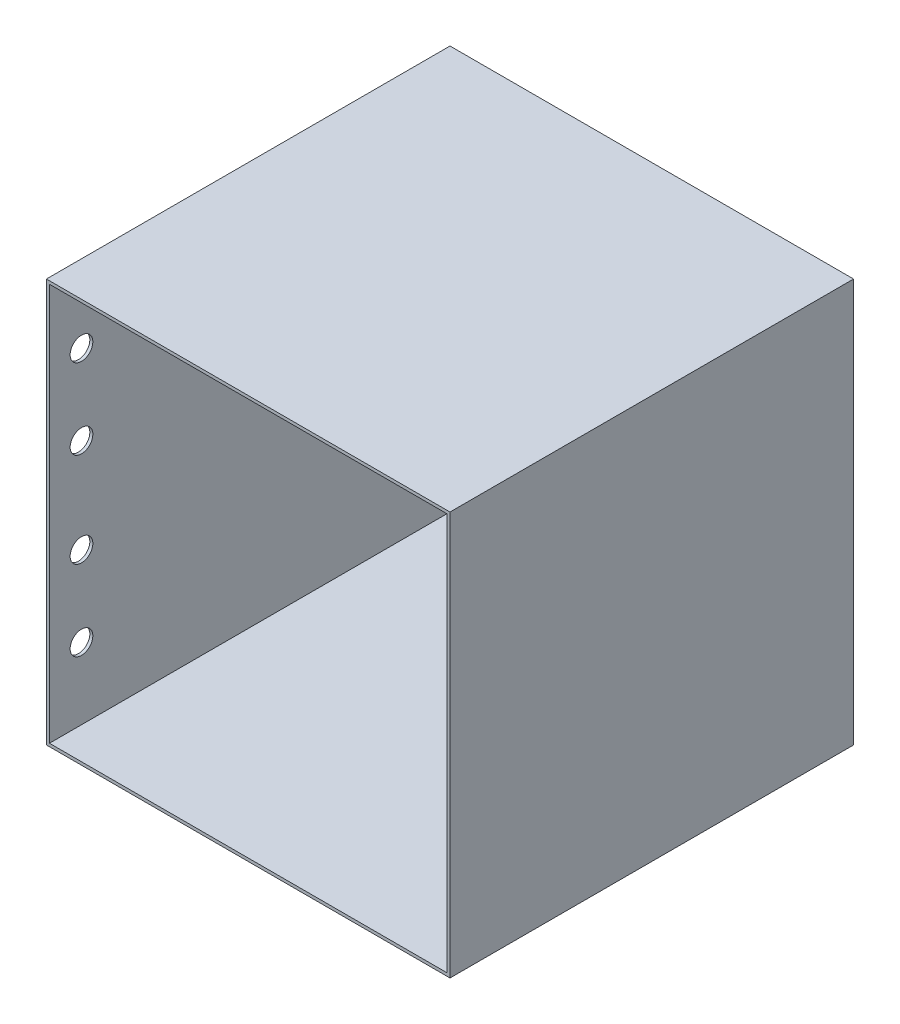
ISO-10303-21;
HEADER;
FILE_DESCRIPTION(('STEP AP214'),'2;1');
FILE_NAME('part.step','',(''),(''),'','','');
FILE_SCHEMA(('AUTOMOTIVE_DESIGN { 1 0 10303 214 1 1 1 1 }'));
ENDSEC;
DATA;
#1=APPLICATION_CONTEXT('core data for automotive mechanical design processes');
#2=APPLICATION_PROTOCOL_DEFINITION('international standard','automotive_design',2000,#1);
#3=PRODUCT_CONTEXT('',#1,'mechanical');
#4=PRODUCT('Part','Part','',(#3));
#5=PRODUCT_RELATED_PRODUCT_CATEGORY('part','',(#4));
#6=PRODUCT_DEFINITION_FORMATION('','',#4);
#7=PRODUCT_DEFINITION_CONTEXT('part definition',#1,'design');
#8=PRODUCT_DEFINITION('design','',#6,#7);
#9=PRODUCT_DEFINITION_SHAPE('','',#8);
#10=(LENGTH_UNIT() NAMED_UNIT(*) SI_UNIT(.MILLI.,.METRE.));
#11=(NAMED_UNIT(*) PLANE_ANGLE_UNIT() SI_UNIT($,.RADIAN.));
#12=(NAMED_UNIT(*) SI_UNIT($,.STERADIAN.) SOLID_ANGLE_UNIT());
#13=UNCERTAINTY_MEASURE_WITH_UNIT(LENGTH_MEASURE(1.E-05),#10,'distance_accuracy_value','');
#14=(GEOMETRIC_REPRESENTATION_CONTEXT(3) GLOBAL_UNCERTAINTY_ASSIGNED_CONTEXT((#13)) GLOBAL_UNIT_ASSIGNED_CONTEXT((#10,
#11,#12)) REPRESENTATION_CONTEXT('',''));
#15=CARTESIAN_POINT('',(0.,0.,0.));
#16=DIRECTION('',(0.,0.,1.));
#17=DIRECTION('',(1.,0.,0.));
#18=AXIS2_PLACEMENT_3D('',#15,#16,#17);
#19=CARTESIAN_POINT('',(0.,0.,80.));
#20=DIRECTION('',(0.,0.,-1.));
#21=DIRECTION('',(-1.,0.,0.));
#22=AXIS2_PLACEMENT_3D('',#19,#20,#21);
#23=PLANE('',#22);
#24=DIRECTION('',(0.,-1.,0.));
#25=VECTOR('',#24,1.);
#26=CARTESIAN_POINT('',(0.,0.,80.));
#27=LINE('',#26,#25);
#28=CARTESIAN_POINT('',(0.,79.9999999999998,80.0000000000002));
#29=VERTEX_POINT('',#28);
#30=CARTESIAN_POINT('',(0.,0.,80.));
#31=VERTEX_POINT('',#30);
#32=EDGE_CURVE('E134',#29,#31,#27,.T.);
#33=ORIENTED_EDGE('',*,*,#32,.T.);
#34=DIRECTION('',(1.,0.,0.));
#35=VECTOR('',#34,1.);
#36=CARTESIAN_POINT('',(0.,0.,80.));
#37=LINE('',#36,#35);
#38=CARTESIAN_POINT('',(80.,0.,80.));
#39=VERTEX_POINT('',#38);
#40=EDGE_CURVE('E137',#31,#39,#37,.T.);
#41=ORIENTED_EDGE('',*,*,#40,.T.);
#42=DIRECTION('',(0.,1.,0.));
#43=VECTOR('',#42,1.);
#44=CARTESIAN_POINT('',(80.,0.,80.));
#45=LINE('',#44,#43);
#46=CARTESIAN_POINT('',(80.,80.0000000000001,80.0000000000002));
#47=VERTEX_POINT('',#46);
#48=EDGE_CURVE('E140',#39,#47,#45,.T.);
#49=ORIENTED_EDGE('',*,*,#48,.T.);
#50=DIRECTION('',(-1.,0.,0.));
#51=VECTOR('',#50,1.);
#52=CARTESIAN_POINT('',(0.,79.9999999999998,80.0000000000002));
#53=LINE('',#52,#51);
#54=EDGE_CURVE('E142',#47,#29,#53,.T.);
#55=ORIENTED_EDGE('',*,*,#54,.T.);
#56=EDGE_LOOP('',(#33,#41,#49,#55));
#57=FACE_BOUND('',#56,.T.);
#58=DIRECTION('',(0.,-1.,0.));
#59=VECTOR('',#58,1.);
#60=CARTESIAN_POINT('',(0.599999999999989,0.,80.));
#61=LINE('',#60,#59);
#62=CARTESIAN_POINT('',(0.600000000000045,79.3999999999999,80.0000000000002));
#63=VERTEX_POINT('',#62);
#64=CARTESIAN_POINT('',(0.600000000000045,0.599999999999934,80.));
#65=VERTEX_POINT('',#64);
#66=EDGE_CURVE('E122',#63,#65,#61,.T.);
#67=ORIENTED_EDGE('',*,*,#66,.F.);
#68=DIRECTION('',(-1.,0.,0.));
#69=VECTOR('',#68,1.);
#70=CARTESIAN_POINT('',(0.,79.3999999999999,80.0000000000002));
#71=LINE('',#70,#69);
#72=CARTESIAN_POINT('',(79.4,79.4000000000001,80.0000000000002));
#73=VERTEX_POINT('',#72);
#74=EDGE_CURVE('E106',#73,#63,#71,.T.);
#75=ORIENTED_EDGE('',*,*,#74,.F.);
#76=DIRECTION('',(0.,1.,0.));
#77=VECTOR('',#76,1.);
#78=CARTESIAN_POINT('',(79.4,0.,80.));
#79=LINE('',#78,#77);
#80=CARTESIAN_POINT('',(79.4,0.600000000000156,80.));
#81=VERTEX_POINT('',#80);
#82=EDGE_CURVE('E131',#81,#73,#79,.T.);
#83=ORIENTED_EDGE('',*,*,#82,.F.);
#84=DIRECTION('',(1.,0.,0.));
#85=VECTOR('',#84,1.);
#86=CARTESIAN_POINT('',(0.,0.599999999999934,80.));
#87=LINE('',#86,#85);
#88=EDGE_CURVE('E124',#65,#81,#87,.T.);
#89=ORIENTED_EDGE('',*,*,#88,.F.);
#90=EDGE_LOOP('',(#67,#75,#83,#89));
#91=FACE_BOUND('',#90,.T.);
#92=ADVANCED_FACE('F36',(#57,#91),#23,.F.);
#93=CARTESIAN_POINT('',(0.,0.,0.));
#94=DIRECTION('',(0.,0.,-1.));
#95=DIRECTION('',(-1.,0.,0.));
#96=AXIS2_PLACEMENT_3D('',#93,#94,#95);
#97=PLANE('',#96);
#98=DIRECTION('',(0.,-1.,0.));
#99=VECTOR('',#98,1.);
#100=CARTESIAN_POINT('',(0.,0.,0.));
#101=LINE('',#100,#99);
#102=CARTESIAN_POINT('',(0.,80.0000000000001,2.22044604925031E-13));
#103=VERTEX_POINT('',#102);
#104=CARTESIAN_POINT('',(0.,0.,0.));
#105=VERTEX_POINT('',#104);
#106=EDGE_CURVE('E145',#103,#105,#101,.T.);
#107=ORIENTED_EDGE('',*,*,#106,.F.);
#108=DIRECTION('',(-1.,0.,0.));
#109=VECTOR('',#108,1.);
#110=CARTESIAN_POINT('',(0.,80.0000000000001,2.22044604925031E-13));
#111=LINE('',#110,#109);
#112=CARTESIAN_POINT('',(80.,79.9999999999996,2.22044604925031E-13));
#113=VERTEX_POINT('',#112);
#114=EDGE_CURVE('E138',#113,#103,#111,.T.);
#115=ORIENTED_EDGE('',*,*,#114,.F.);
#116=DIRECTION('',(0.,1.,0.));
#117=VECTOR('',#116,1.);
#118=CARTESIAN_POINT('',(80.,-4.44089209850063E-13,0.));
#119=LINE('',#118,#117);
#120=CARTESIAN_POINT('',(80.,-4.44089209850063E-13,0.));
#121=VERTEX_POINT('',#120);
#122=EDGE_CURVE('E150',#121,#113,#119,.T.);
#123=ORIENTED_EDGE('',*,*,#122,.F.);
#124=DIRECTION('',(1.,0.,0.));
#125=VECTOR('',#124,1.);
#126=CARTESIAN_POINT('',(0.,0.,0.));
#127=LINE('',#126,#125);
#128=EDGE_CURVE('E148',#105,#121,#127,.T.);
#129=ORIENTED_EDGE('',*,*,#128,.F.);
#130=EDGE_LOOP('',(#107,#115,#123,#129));
#131=FACE_BOUND('',#130,.T.);
#132=DIRECTION('',(-1.,0.,0.));
#133=VECTOR('',#132,1.);
#134=CARTESIAN_POINT('',(0.,79.3999999999999,0.));
#135=LINE('',#134,#133);
#136=CARTESIAN_POINT('',(79.4,79.3999999999999,0.));
#137=VERTEX_POINT('',#136);
#138=CARTESIAN_POINT('',(0.600000000000045,79.3999999999999,0.));
#139=VERTEX_POINT('',#138);
#140=EDGE_CURVE('E104',#137,#139,#135,.T.);
#141=ORIENTED_EDGE('',*,*,#140,.T.);
#142=DIRECTION('',(0.,-1.,0.));
#143=VECTOR('',#142,1.);
#144=CARTESIAN_POINT('',(0.599999999999989,0.,0.));
#145=LINE('',#144,#143);
#146=CARTESIAN_POINT('',(0.600000000000045,0.599999999999934,0.));
#147=VERTEX_POINT('',#146);
#148=EDGE_CURVE('E112',#139,#147,#145,.T.);
#149=ORIENTED_EDGE('',*,*,#148,.T.);
#150=DIRECTION('',(1.,0.,0.));
#151=VECTOR('',#150,1.);
#152=CARTESIAN_POINT('',(0.,0.599999999999934,0.));
#153=LINE('',#152,#151);
#154=CARTESIAN_POINT('',(79.4,0.599999999999934,0.));
#155=VERTEX_POINT('',#154);
#156=EDGE_CURVE('E118',#147,#155,#153,.T.);
#157=ORIENTED_EDGE('',*,*,#156,.T.);
#158=DIRECTION('',(0.,1.,0.));
#159=VECTOR('',#158,1.);
#160=CARTESIAN_POINT('',(79.4,0.,0.));
#161=LINE('',#160,#159);
#162=EDGE_CURVE('E58',#155,#137,#161,.T.);
#163=ORIENTED_EDGE('',*,*,#162,.T.);
#164=EDGE_LOOP('',(#141,#149,#157,#163));
#165=FACE_BOUND('',#164,.T.);
#166=ADVANCED_FACE('F121',(#131,#165),#97,.T.);
#167=CARTESIAN_POINT('',(0.,0.,80.));
#168=DIRECTION('',(1.,0.,0.));
#169=DIRECTION('',(0.,0.,-1.));
#170=AXIS2_PLACEMENT_3D('',#167,#168,#169);
#171=PLANE('',#170);
#172=CARTESIAN_POINT('',(0.,14.7624935440487,73.6499999999999));
#173=DIRECTION('',(1.,0.,0.));
#174=DIRECTION('',(0.,0.,-1.));
#175=AXIS2_PLACEMENT_3D('',#172,#173,#174);
#176=CIRCLE('',#175,2.25);
#177=CARTESIAN_POINT('',(0.,14.7624935440487,71.3999999999999));
#178=VERTEX_POINT('',#177);
#179=EDGE_CURVE('E253',#178,#178,#176,.T.);
#180=ORIENTED_EDGE('',*,*,#179,.T.);
#181=EDGE_LOOP('',(#180));
#182=FACE_BOUND('',#181,.T.);
#183=CARTESIAN_POINT('',(0.,30.6374935440485,73.6499999999997));
#184=DIRECTION('',(1.,0.,0.));
#185=DIRECTION('',(0.,0.,-1.));
#186=AXIS2_PLACEMENT_3D('',#183,#184,#185);
#187=CIRCLE('',#186,2.25);
#188=CARTESIAN_POINT('',(0.,30.6374935440485,71.3999999999997));
#189=VERTEX_POINT('',#188);
#190=EDGE_CURVE('E247',#189,#189,#187,.T.);
#191=ORIENTED_EDGE('',*,*,#190,.T.);
#192=EDGE_LOOP('',(#191));
#193=FACE_BOUND('',#192,.T.);
#194=CARTESIAN_POINT('',(0.,49.3624953746783,73.6500000000004));
#195=DIRECTION('',(1.,0.,0.));
#196=DIRECTION('',(0.,0.,-1.));
#197=AXIS2_PLACEMENT_3D('',#194,#195,#196);
#198=CIRCLE('',#197,2.25);
#199=CARTESIAN_POINT('',(0.,49.3624953746783,71.4000000000004));
#200=VERTEX_POINT('',#199);
#201=EDGE_CURVE('E234',#200,#200,#198,.T.);
#202=ORIENTED_EDGE('',*,*,#201,.T.);
#203=EDGE_LOOP('',(#202));
#204=FACE_BOUND('',#203,.T.);
#205=CARTESIAN_POINT('',(0.,65.2374953746782,73.6500000000003));
#206=DIRECTION('',(1.,0.,0.));
#207=DIRECTION('',(0.,0.,-1.));
#208=AXIS2_PLACEMENT_3D('',#205,#206,#207);
#209=CIRCLE('',#208,2.25);
#210=CARTESIAN_POINT('',(0.,65.2374953746782,71.4000000000003));
#211=VERTEX_POINT('',#210);
#212=EDGE_CURVE('E119',#211,#211,#209,.T.);
#213=ORIENTED_EDGE('',*,*,#212,.T.);
#214=EDGE_LOOP('',(#213));
#215=FACE_BOUND('',#214,.T.);
#216=ORIENTED_EDGE('',*,*,#106,.T.);
#217=DIRECTION('',(0.,0.,-1.));
#218=VECTOR('',#217,1.);
#219=CARTESIAN_POINT('',(0.,0.,80.));
#220=LINE('',#219,#218);
#221=EDGE_CURVE('E11',#31,#105,#220,.T.);
#222=ORIENTED_EDGE('',*,*,#221,.F.);
#223=ORIENTED_EDGE('',*,*,#32,.F.);
#224=DIRECTION('',(0.,0.,-1.));
#225=VECTOR('',#224,1.);
#226=CARTESIAN_POINT('',(0.,79.9999999999998,80.0000000000002));
#227=LINE('',#226,#225);
#228=EDGE_CURVE('E144',#29,#103,#227,.T.);
#229=ORIENTED_EDGE('',*,*,#228,.T.);
#230=EDGE_LOOP('',(#216,#222,#223,#229));
#231=FACE_BOUND('',#230,.T.);
#232=ADVANCED_FACE('F38',(#182,#193,#204,#215,#231),#171,.F.);
#233=CARTESIAN_POINT('',(0.,0.,80.));
#234=DIRECTION('',(0.,1.,0.));
#235=DIRECTION('',(0.,0.,1.));
#236=AXIS2_PLACEMENT_3D('',#233,#234,#235);
#237=PLANE('',#236);
#238=ORIENTED_EDGE('',*,*,#128,.T.);
#239=DIRECTION('',(0.,0.,-1.));
#240=VECTOR('',#239,1.);
#241=CARTESIAN_POINT('',(80.,0.,80.));
#242=LINE('',#241,#240);
#243=EDGE_CURVE('E44',#39,#121,#242,.T.);
#244=ORIENTED_EDGE('',*,*,#243,.F.);
#245=ORIENTED_EDGE('',*,*,#40,.F.);
#246=ORIENTED_EDGE('',*,*,#221,.T.);
#247=EDGE_LOOP('',(#238,#244,#245,#246));
#248=FACE_BOUND('',#247,.T.);
#249=ADVANCED_FACE('F177',(#248),#237,.F.);
#250=CARTESIAN_POINT('',(80.,0.,80.));
#251=DIRECTION('',(-1.,0.,0.));
#252=DIRECTION('',(0.,0.,1.));
#253=AXIS2_PLACEMENT_3D('',#250,#251,#252);
#254=PLANE('',#253);
#255=ORIENTED_EDGE('',*,*,#122,.T.);
#256=DIRECTION('',(0.,0.,-1.));
#257=VECTOR('',#256,1.);
#258=CARTESIAN_POINT('',(80.,80.0000000000001,80.0000000000002));
#259=LINE('',#258,#257);
#260=EDGE_CURVE('E155',#47,#113,#259,.T.);
#261=ORIENTED_EDGE('',*,*,#260,.F.);
#262=ORIENTED_EDGE('',*,*,#48,.F.);
#263=ORIENTED_EDGE('',*,*,#243,.T.);
#264=EDGE_LOOP('',(#255,#261,#262,#263));
#265=FACE_BOUND('',#264,.T.);
#266=ADVANCED_FACE('F162',(#265),#254,.F.);
#267=CARTESIAN_POINT('',(0.,79.9999999999998,80.0000000000002));
#268=DIRECTION('',(0.,-1.,0.));
#269=DIRECTION('',(0.,0.,-1.));
#270=AXIS2_PLACEMENT_3D('',#267,#268,#269);
#271=PLANE('',#270);
#272=ORIENTED_EDGE('',*,*,#114,.T.);
#273=ORIENTED_EDGE('',*,*,#228,.F.);
#274=ORIENTED_EDGE('',*,*,#54,.F.);
#275=ORIENTED_EDGE('',*,*,#260,.T.);
#276=EDGE_LOOP('',(#272,#273,#274,#275));
#277=FACE_BOUND('',#276,.T.);
#278=ADVANCED_FACE('F170',(#277),#271,.F.);
#279=CARTESIAN_POINT('',(0.599999999999989,0.,80.));
#280=DIRECTION('',(1.,0.,0.));
#281=DIRECTION('',(0.,0.,-1.));
#282=AXIS2_PLACEMENT_3D('',#279,#280,#281);
#283=PLANE('',#282);
#284=CARTESIAN_POINT('',(0.600000000000045,14.7624935440487,73.6499999999999));
#285=DIRECTION('',(-1.,0.,0.));
#286=DIRECTION('',(0.,0.,1.));
#287=AXIS2_PLACEMENT_3D('',#284,#285,#286);
#288=CIRCLE('',#287,2.25);
#289=CARTESIAN_POINT('',(0.600000000000045,14.7624935440487,75.8999999999999));
#290=VERTEX_POINT('',#289);
#291=EDGE_CURVE('E256',#290,#290,#288,.T.);
#292=ORIENTED_EDGE('',*,*,#291,.T.);
#293=EDGE_LOOP('',(#292));
#294=FACE_BOUND('',#293,.T.);
#295=CARTESIAN_POINT('',(0.600000000000045,30.6374935440485,73.6499999999997));
#296=DIRECTION('',(-1.,0.,0.));
#297=DIRECTION('',(0.,0.,1.));
#298=AXIS2_PLACEMENT_3D('',#295,#296,#297);
#299=CIRCLE('',#298,2.25);
#300=CARTESIAN_POINT('',(0.600000000000045,30.6374935440485,75.8999999999997));
#301=VERTEX_POINT('',#300);
#302=EDGE_CURVE('E250',#301,#301,#299,.T.);
#303=ORIENTED_EDGE('',*,*,#302,.T.);
#304=EDGE_LOOP('',(#303));
#305=FACE_BOUND('',#304,.T.);
#306=CARTESIAN_POINT('',(0.600000000000017,49.3624953746781,73.6500000000004));
#307=DIRECTION('',(-1.,0.,0.));
#308=DIRECTION('',(0.,0.,1.));
#309=AXIS2_PLACEMENT_3D('',#306,#307,#308);
#310=CIRCLE('',#309,2.25);
#311=CARTESIAN_POINT('',(0.600000000000017,49.3624953746781,75.9000000000004));
#312=VERTEX_POINT('',#311);
#313=EDGE_CURVE('E244',#312,#312,#310,.T.);
#314=ORIENTED_EDGE('',*,*,#313,.T.);
#315=EDGE_LOOP('',(#314));
#316=FACE_BOUND('',#315,.T.);
#317=CARTESIAN_POINT('',(0.600000000000017,65.2374953746782,73.6500000000003));
#318=DIRECTION('',(-1.,0.,0.));
#319=DIRECTION('',(0.,0.,1.));
#320=AXIS2_PLACEMENT_3D('',#317,#318,#319);
#321=CIRCLE('',#320,2.25);
#322=CARTESIAN_POINT('',(0.600000000000017,65.2374953746782,75.9000000000003));
#323=VERTEX_POINT('',#322);
#324=EDGE_CURVE('E229',#323,#323,#321,.T.);
#325=ORIENTED_EDGE('',*,*,#324,.T.);
#326=EDGE_LOOP('',(#325));
#327=FACE_BOUND('',#326,.T.);
#328=ORIENTED_EDGE('',*,*,#148,.F.);
#329=DIRECTION('',(0.,0.,-1.));
#330=VECTOR('',#329,1.);
#331=CARTESIAN_POINT('',(0.600000000000045,79.3999999999999,80.0000000000002));
#332=LINE('',#331,#330);
#333=EDGE_CURVE('E100',#63,#139,#332,.T.);
#334=ORIENTED_EDGE('',*,*,#333,.F.);
#335=ORIENTED_EDGE('',*,*,#66,.T.);
#336=DIRECTION('',(0.,0.,-1.));
#337=VECTOR('',#336,1.);
#338=CARTESIAN_POINT('',(0.600000000000045,0.599999999999934,80.));
#339=LINE('',#338,#337);
#340=EDGE_CURVE('E115',#65,#147,#339,.T.);
#341=ORIENTED_EDGE('',*,*,#340,.T.);
#342=EDGE_LOOP('',(#328,#334,#335,#341));
#343=FACE_BOUND('',#342,.T.);
#344=ADVANCED_FACE('F113',(#294,#305,#316,#327,#343),#283,.T.);
#345=CARTESIAN_POINT('',(0.,0.599999999999934,80.));
#346=DIRECTION('',(0.,1.,0.));
#347=DIRECTION('',(0.,0.,1.));
#348=AXIS2_PLACEMENT_3D('',#345,#346,#347);
#349=PLANE('',#348);
#350=ORIENTED_EDGE('',*,*,#156,.F.);
#351=ORIENTED_EDGE('',*,*,#340,.F.);
#352=ORIENTED_EDGE('',*,*,#88,.T.);
#353=DIRECTION('',(0.,0.,-1.));
#354=VECTOR('',#353,1.);
#355=CARTESIAN_POINT('',(79.4,0.600000000000156,80.));
#356=LINE('',#355,#354);
#357=EDGE_CURVE('E238',#81,#155,#356,.T.);
#358=ORIENTED_EDGE('',*,*,#357,.T.);
#359=EDGE_LOOP('',(#350,#351,#352,#358));
#360=FACE_BOUND('',#359,.T.);
#361=ADVANCED_FACE('F198',(#360),#349,.T.);
#362=CARTESIAN_POINT('',(79.4,0.,80.));
#363=DIRECTION('',(-1.,0.,0.));
#364=DIRECTION('',(0.,0.,1.));
#365=AXIS2_PLACEMENT_3D('',#362,#363,#364);
#366=PLANE('',#365);
#367=ORIENTED_EDGE('',*,*,#162,.F.);
#368=ORIENTED_EDGE('',*,*,#357,.F.);
#369=ORIENTED_EDGE('',*,*,#82,.T.);
#370=DIRECTION('',(0.,0.,-1.));
#371=VECTOR('',#370,1.);
#372=CARTESIAN_POINT('',(79.4,79.4000000000001,80.0000000000002));
#373=LINE('',#372,#371);
#374=EDGE_CURVE('E51',#73,#137,#373,.T.);
#375=ORIENTED_EDGE('',*,*,#374,.T.);
#376=EDGE_LOOP('',(#367,#368,#369,#375));
#377=FACE_BOUND('',#376,.T.);
#378=ADVANCED_FACE('F204',(#377),#366,.T.);
#379=CARTESIAN_POINT('',(0.,79.3999999999999,80.0000000000002));
#380=DIRECTION('',(0.,-1.,0.));
#381=DIRECTION('',(0.,0.,-1.));
#382=AXIS2_PLACEMENT_3D('',#379,#380,#381);
#383=PLANE('',#382);
#384=ORIENTED_EDGE('',*,*,#140,.F.);
#385=ORIENTED_EDGE('',*,*,#374,.F.);
#386=ORIENTED_EDGE('',*,*,#74,.T.);
#387=ORIENTED_EDGE('',*,*,#333,.T.);
#388=EDGE_LOOP('',(#384,#385,#386,#387));
#389=FACE_BOUND('',#388,.T.);
#390=ADVANCED_FACE('F102',(#389),#383,.T.);
#391=CARTESIAN_POINT('',(-1.00000091531471,65.2374953746782,73.6500000000003));
#392=DIRECTION('',(-1.,0.,0.));
#393=DIRECTION('',(0.,0.,1.));
#394=AXIS2_PLACEMENT_3D('',#391,#392,#393);
#395=CYLINDRICAL_SURFACE('',#394,2.25);
#396=ORIENTED_EDGE('',*,*,#324,.F.);
#397=EDGE_LOOP('',(#396));
#398=FACE_BOUND('',#397,.T.);
#399=ORIENTED_EDGE('',*,*,#212,.F.);
#400=EDGE_LOOP('',(#399));
#401=FACE_BOUND('',#400,.T.);
#402=ADVANCED_FACE('F210',(#398,#401),#395,.F.);
#403=CARTESIAN_POINT('',(-1.00000091531471,49.3624953746783,73.6500000000004));
#404=DIRECTION('',(-1.,0.,0.));
#405=DIRECTION('',(0.,0.,1.));
#406=AXIS2_PLACEMENT_3D('',#403,#404,#405);
#407=CYLINDRICAL_SURFACE('',#406,2.25);
#408=ORIENTED_EDGE('',*,*,#313,.F.);
#409=EDGE_LOOP('',(#408));
#410=FACE_BOUND('',#409,.T.);
#411=ORIENTED_EDGE('',*,*,#201,.F.);
#412=EDGE_LOOP('',(#411));
#413=FACE_BOUND('',#412,.T.);
#414=ADVANCED_FACE('F219',(#410,#413),#407,.F.);
#415=CARTESIAN_POINT('',(-1.00000091531466,30.6374935440485,73.6499999999997));
#416=DIRECTION('',(-1.,0.,0.));
#417=DIRECTION('',(0.,0.,1.));
#418=AXIS2_PLACEMENT_3D('',#415,#416,#417);
#419=CYLINDRICAL_SURFACE('',#418,2.25);
#420=ORIENTED_EDGE('',*,*,#302,.F.);
#421=EDGE_LOOP('',(#420));
#422=FACE_BOUND('',#421,.T.);
#423=ORIENTED_EDGE('',*,*,#190,.F.);
#424=EDGE_LOOP('',(#423));
#425=FACE_BOUND('',#424,.T.);
#426=ADVANCED_FACE('F224',(#422,#425),#419,.F.);
#427=CARTESIAN_POINT('',(-1.00000091531466,14.7624935440487,73.6499999999999));
#428=DIRECTION('',(-1.,0.,0.));
#429=DIRECTION('',(0.,0.,1.));
#430=AXIS2_PLACEMENT_3D('',#427,#428,#429);
#431=CYLINDRICAL_SURFACE('',#430,2.25);
#432=ORIENTED_EDGE('',*,*,#291,.F.);
#433=EDGE_LOOP('',(#432));
#434=FACE_BOUND('',#433,.T.);
#435=ORIENTED_EDGE('',*,*,#179,.F.);
#436=EDGE_LOOP('',(#435));
#437=FACE_BOUND('',#436,.T.);
#438=ADVANCED_FACE('F259',(#434,#437),#431,.F.);
#439=CLOSED_SHELL('',(#92,#166,#232,#249,#266,#278,#344,#361,#378,#390,#402,#414,#426,#438));
#440=MANIFOLD_SOLID_BREP('B2',#439);
#441=ADVANCED_BREP_SHAPE_REPRESENTATION('',(#18,#440),#14);
#442=SHAPE_DEFINITION_REPRESENTATION(#9,#441);
ENDSEC;
END-ISO-10303-21;
